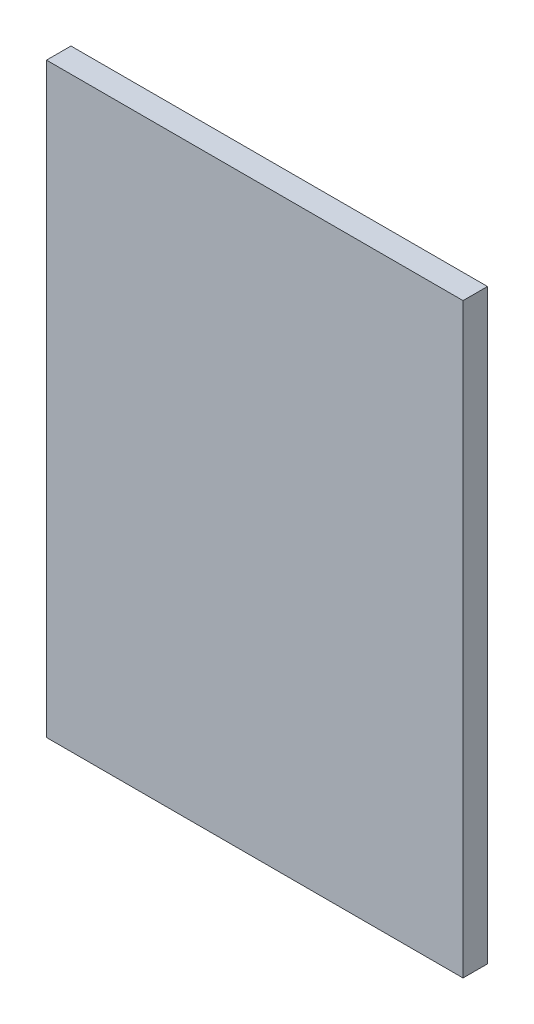
ISO-10303-21;
HEADER;
FILE_DESCRIPTION(('STEP AP214'),'2;1');
FILE_NAME('part.step','',(''),(''),'','','');
FILE_SCHEMA(('AUTOMOTIVE_DESIGN { 1 0 10303 214 1 1 1 1 }'));
ENDSEC;
DATA;
#1=APPLICATION_CONTEXT('core data for automotive mechanical design processes');
#2=APPLICATION_PROTOCOL_DEFINITION('international standard','automotive_design',2000,#1);
#3=PRODUCT_CONTEXT('',#1,'mechanical');
#4=PRODUCT('Part','Part','',(#3));
#5=PRODUCT_RELATED_PRODUCT_CATEGORY('part','',(#4));
#6=PRODUCT_DEFINITION_FORMATION('','',#4);
#7=PRODUCT_DEFINITION_CONTEXT('part definition',#1,'design');
#8=PRODUCT_DEFINITION('design','',#6,#7);
#9=PRODUCT_DEFINITION_SHAPE('','',#8);
#10=(LENGTH_UNIT() NAMED_UNIT(*) SI_UNIT(.MILLI.,.METRE.));
#11=(NAMED_UNIT(*) PLANE_ANGLE_UNIT() SI_UNIT($,.RADIAN.));
#12=(NAMED_UNIT(*) SI_UNIT($,.STERADIAN.) SOLID_ANGLE_UNIT());
#13=UNCERTAINTY_MEASURE_WITH_UNIT(LENGTH_MEASURE(1.E-05),#10,'distance_accuracy_value','');
#14=(GEOMETRIC_REPRESENTATION_CONTEXT(3) GLOBAL_UNCERTAINTY_ASSIGNED_CONTEXT((#13)) GLOBAL_UNIT_ASSIGNED_CONTEXT((#10,
#11,#12)) REPRESENTATION_CONTEXT('',''));
#15=CARTESIAN_POINT('',(0.,0.,0.));
#16=DIRECTION('',(0.,0.,1.));
#17=DIRECTION('',(1.,0.,0.));
#18=AXIS2_PLACEMENT_3D('',#15,#16,#17);
#19=CARTESIAN_POINT('',(-54.102,6.22659010600706,3.175));
#20=DIRECTION('',(1.,0.,0.));
#21=DIRECTION('',(0.,0.,-1.));
#22=AXIS2_PLACEMENT_3D('',#19,#20,#21);
#23=PLANE('',#22);
#24=DIRECTION('',(0.,-1.,0.));
#25=VECTOR('',#24,1.);
#26=CARTESIAN_POINT('',(-54.102,6.22659010600706,0.));
#27=LINE('',#26,#25);
#28=CARTESIAN_POINT('',(-54.102,82.4265901060071,0.));
#29=VERTEX_POINT('',#28);
#30=CARTESIAN_POINT('',(-54.102,6.22659010600706,0.));
#31=VERTEX_POINT('',#30);
#32=EDGE_CURVE('E96',#29,#31,#27,.T.);
#33=ORIENTED_EDGE('',*,*,#32,.T.);
#34=DIRECTION('',(0.,0.,-1.));
#35=VECTOR('',#34,1.);
#36=CARTESIAN_POINT('',(-54.102,6.22659010600706,3.175));
#37=LINE('',#36,#35);
#38=CARTESIAN_POINT('',(-54.102,6.22659010600706,3.175));
#39=VERTEX_POINT('',#38);
#40=EDGE_CURVE('E11',#39,#31,#37,.T.);
#41=ORIENTED_EDGE('',*,*,#40,.F.);
#42=DIRECTION('',(0.,-1.,0.));
#43=VECTOR('',#42,1.);
#44=CARTESIAN_POINT('',(-54.102,6.22659010600706,3.175));
#45=LINE('',#44,#43);
#46=CARTESIAN_POINT('',(-54.102,82.4265901060071,3.175));
#47=VERTEX_POINT('',#46);
#48=EDGE_CURVE('E84',#47,#39,#45,.T.);
#49=ORIENTED_EDGE('',*,*,#48,.F.);
#50=DIRECTION('',(0.,0.,-1.));
#51=VECTOR('',#50,1.);
#52=CARTESIAN_POINT('',(-54.102,82.4265901060071,3.175));
#53=LINE('',#52,#51);
#54=EDGE_CURVE('E92',#47,#29,#53,.T.);
#55=ORIENTED_EDGE('',*,*,#54,.T.);
#56=EDGE_LOOP('',(#33,#41,#49,#55));
#57=FACE_BOUND('',#56,.T.);
#58=ADVANCED_FACE('F33',(#57),#23,.F.);
#59=CARTESIAN_POINT('',(-54.102,6.22659010600706,3.175));
#60=DIRECTION('',(0.,1.,0.));
#61=DIRECTION('',(0.,0.,1.));
#62=AXIS2_PLACEMENT_3D('',#59,#60,#61);
#63=PLANE('',#62);
#64=DIRECTION('',(1.,0.,0.));
#65=VECTOR('',#64,1.);
#66=CARTESIAN_POINT('',(-54.102,6.22659010600706,0.));
#67=LINE('',#66,#65);
#68=CARTESIAN_POINT('',(0.,6.22659010600706,0.));
#69=VERTEX_POINT('',#68);
#70=EDGE_CURVE('E88',#31,#69,#67,.T.);
#71=ORIENTED_EDGE('',*,*,#70,.T.);
#72=DIRECTION('',(0.,0.,-1.));
#73=VECTOR('',#72,1.);
#74=CARTESIAN_POINT('',(0.,6.22659010600706,3.175));
#75=LINE('',#74,#73);
#76=CARTESIAN_POINT('',(0.,6.22659010600706,3.175));
#77=VERTEX_POINT('',#76);
#78=EDGE_CURVE('E41',#77,#69,#75,.T.);
#79=ORIENTED_EDGE('',*,*,#78,.F.);
#80=DIRECTION('',(1.,0.,0.));
#81=VECTOR('',#80,1.);
#82=CARTESIAN_POINT('',(-54.102,6.22659010600706,3.175));
#83=LINE('',#82,#81);
#84=EDGE_CURVE('E79',#39,#77,#83,.T.);
#85=ORIENTED_EDGE('',*,*,#84,.F.);
#86=ORIENTED_EDGE('',*,*,#40,.T.);
#87=EDGE_LOOP('',(#71,#79,#85,#86));
#88=FACE_BOUND('',#87,.T.);
#89=ADVANCED_FACE('F87',(#88),#63,.F.);
#90=CARTESIAN_POINT('',(0.,6.22659010600706,3.175));
#91=DIRECTION('',(-1.,0.,0.));
#92=DIRECTION('',(0.,0.,1.));
#93=AXIS2_PLACEMENT_3D('',#90,#91,#92);
#94=PLANE('',#93);
#95=DIRECTION('',(0.,1.,0.));
#96=VECTOR('',#95,1.);
#97=CARTESIAN_POINT('',(0.,6.22659010600706,0.));
#98=LINE('',#97,#96);
#99=CARTESIAN_POINT('',(0.,82.4265901060071,0.));
#100=VERTEX_POINT('',#99);
#101=EDGE_CURVE('E66',#69,#100,#98,.T.);
#102=ORIENTED_EDGE('',*,*,#101,.T.);
#103=DIRECTION('',(0.,0.,-1.));
#104=VECTOR('',#103,1.);
#105=CARTESIAN_POINT('',(0.,82.4265901060071,3.175));
#106=LINE('',#105,#104);
#107=CARTESIAN_POINT('',(0.,82.4265901060071,3.175));
#108=VERTEX_POINT('',#107);
#109=EDGE_CURVE('E89',#108,#100,#106,.T.);
#110=ORIENTED_EDGE('',*,*,#109,.F.);
#111=DIRECTION('',(0.,1.,0.));
#112=VECTOR('',#111,1.);
#113=CARTESIAN_POINT('',(0.,6.22659010600706,3.175));
#114=LINE('',#113,#112);
#115=EDGE_CURVE('E82',#77,#108,#114,.T.);
#116=ORIENTED_EDGE('',*,*,#115,.F.);
#117=ORIENTED_EDGE('',*,*,#78,.T.);
#118=EDGE_LOOP('',(#102,#110,#116,#117));
#119=FACE_BOUND('',#118,.T.);
#120=ADVANCED_FACE('F90',(#119),#94,.F.);
#121=CARTESIAN_POINT('',(-54.102,82.4265901060071,3.175));
#122=DIRECTION('',(0.,-1.,0.));
#123=DIRECTION('',(0.,0.,-1.));
#124=AXIS2_PLACEMENT_3D('',#121,#122,#123);
#125=PLANE('',#124);
#126=DIRECTION('',(-1.,0.,0.));
#127=VECTOR('',#126,1.);
#128=CARTESIAN_POINT('',(-54.102,82.4265901060071,0.));
#129=LINE('',#128,#127);
#130=EDGE_CURVE('E72',#100,#29,#129,.T.);
#131=ORIENTED_EDGE('',*,*,#130,.T.);
#132=ORIENTED_EDGE('',*,*,#54,.F.);
#133=DIRECTION('',(-1.,0.,0.));
#134=VECTOR('',#133,1.);
#135=CARTESIAN_POINT('',(-54.102,82.4265901060071,3.175));
#136=LINE('',#135,#134);
#137=EDGE_CURVE('E49',#108,#47,#136,.T.);
#138=ORIENTED_EDGE('',*,*,#137,.F.);
#139=ORIENTED_EDGE('',*,*,#109,.T.);
#140=EDGE_LOOP('',(#131,#132,#138,#139));
#141=FACE_BOUND('',#140,.T.);
#142=ADVANCED_FACE('F103',(#141),#125,.F.);
#143=CARTESIAN_POINT('',(0.,0.,3.175));
#144=DIRECTION('',(0.,0.,-1.));
#145=DIRECTION('',(-1.,0.,0.));
#146=AXIS2_PLACEMENT_3D('',#143,#144,#145);
#147=PLANE('',#146);
#148=ORIENTED_EDGE('',*,*,#48,.T.);
#149=ORIENTED_EDGE('',*,*,#84,.T.);
#150=ORIENTED_EDGE('',*,*,#115,.T.);
#151=ORIENTED_EDGE('',*,*,#137,.T.);
#152=EDGE_LOOP('',(#148,#149,#150,#151));
#153=FACE_BOUND('',#152,.T.);
#154=ADVANCED_FACE('F80',(#153),#147,.F.);
#155=CARTESIAN_POINT('',(0.,0.,0.));
#156=DIRECTION('',(0.,0.,-1.));
#157=DIRECTION('',(-1.,0.,0.));
#158=AXIS2_PLACEMENT_3D('',#155,#156,#157);
#159=PLANE('',#158);
#160=ORIENTED_EDGE('',*,*,#32,.F.);
#161=ORIENTED_EDGE('',*,*,#130,.F.);
#162=ORIENTED_EDGE('',*,*,#101,.F.);
#163=ORIENTED_EDGE('',*,*,#70,.F.);
#164=EDGE_LOOP('',(#160,#161,#162,#163));
#165=FACE_BOUND('',#164,.T.);
#166=ADVANCED_FACE('F106',(#165),#159,.T.);
#167=CLOSED_SHELL('',(#58,#89,#120,#142,#154,#166));
#168=MANIFOLD_SOLID_BREP('B2',#167);
#169=ADVANCED_BREP_SHAPE_REPRESENTATION('',(#18,#168),#14);
#170=SHAPE_DEFINITION_REPRESENTATION(#9,#169);
ENDSEC;
END-ISO-10303-21;
